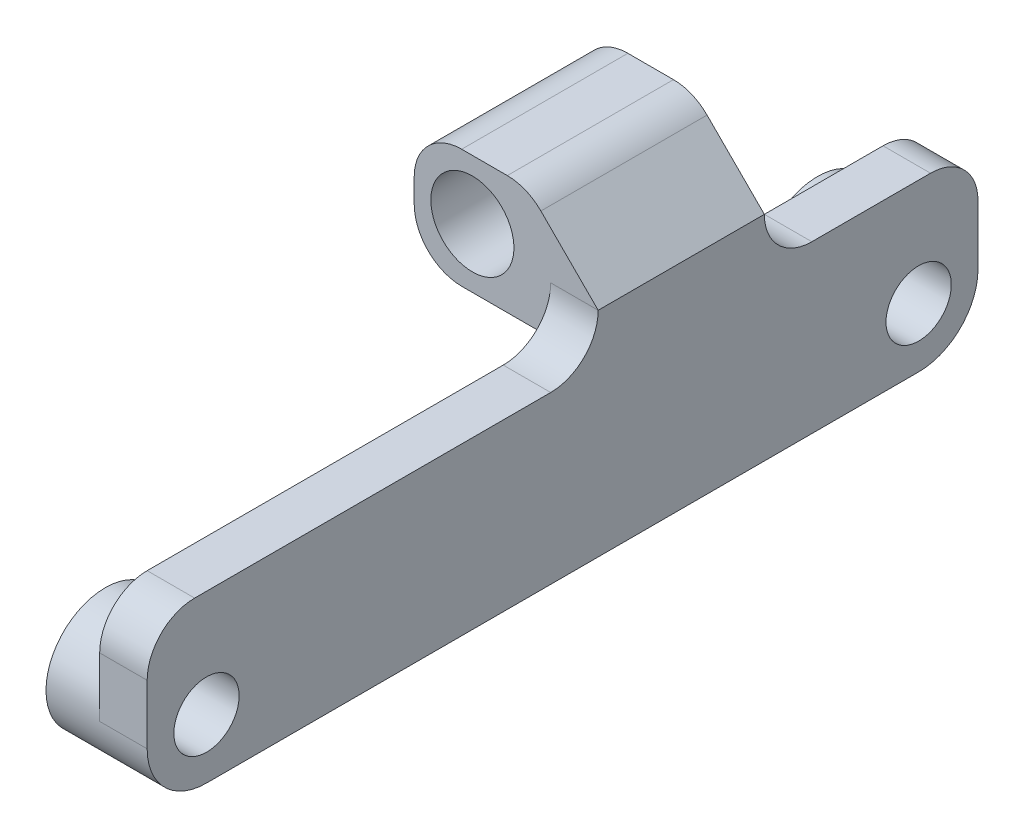
ISO-10303-21;
HEADER;
FILE_DESCRIPTION(('STEP AP214'),'2;1');
FILE_NAME('part.step','',(''),(''),'','','');
FILE_SCHEMA(('AUTOMOTIVE_DESIGN { 1 0 10303 214 1 1 1 1 }'));
ENDSEC;
DATA;
#1=APPLICATION_CONTEXT('core data for automotive mechanical design processes');
#2=APPLICATION_PROTOCOL_DEFINITION('international standard','automotive_design',2000,#1);
#3=PRODUCT_CONTEXT('',#1,'mechanical');
#4=PRODUCT('Part','Part','',(#3));
#5=PRODUCT_RELATED_PRODUCT_CATEGORY('part','',(#4));
#6=PRODUCT_DEFINITION_FORMATION('','',#4);
#7=PRODUCT_DEFINITION_CONTEXT('part definition',#1,'design');
#8=PRODUCT_DEFINITION('design','',#6,#7);
#9=PRODUCT_DEFINITION_SHAPE('','',#8);
#10=(LENGTH_UNIT() NAMED_UNIT(*) SI_UNIT(.MILLI.,.METRE.));
#11=(NAMED_UNIT(*) PLANE_ANGLE_UNIT() SI_UNIT($,.RADIAN.));
#12=(NAMED_UNIT(*) SI_UNIT($,.STERADIAN.) SOLID_ANGLE_UNIT());
#13=UNCERTAINTY_MEASURE_WITH_UNIT(LENGTH_MEASURE(1.E-05),#10,'distance_accuracy_value','');
#14=(GEOMETRIC_REPRESENTATION_CONTEXT(3) GLOBAL_UNCERTAINTY_ASSIGNED_CONTEXT((#13)) GLOBAL_UNIT_ASSIGNED_CONTEXT((#10,
#11,#12)) REPRESENTATION_CONTEXT('',''));
#15=CARTESIAN_POINT('',(0.,0.,0.));
#16=DIRECTION('',(0.,0.,1.));
#17=DIRECTION('',(1.,0.,0.));
#18=AXIS2_PLACEMENT_3D('',#15,#16,#17);
#19=CARTESIAN_POINT('',(9.1,8.99999999999958,-35.));
#20=DIRECTION('',(0.,-1.,0.));
#21=DIRECTION('',(0.,0.,-1.));
#22=AXIS2_PLACEMENT_3D('',#19,#20,#21);
#23=PLANE('',#22);
#24=DIRECTION('',(0.,0.,1.));
#25=VECTOR('',#24,1.);
#26=CARTESIAN_POINT('',(5.1,8.99999999999958,-35.));
#27=LINE('',#26,#25);
#28=CARTESIAN_POINT('',(5.1,8.99999999999958,1.));
#29=VERTEX_POINT('',#28);
#30=CARTESIAN_POINT('',(5.1,8.99999999999958,31.));
#31=VERTEX_POINT('',#30);
#32=EDGE_CURVE('E323',#29,#31,#27,.T.);
#33=ORIENTED_EDGE('',*,*,#32,.T.);
#34=DIRECTION('',(-1.,0.,0.));
#35=VECTOR('',#34,1.);
#36=CARTESIAN_POINT('',(9.1,8.99999999999958,31.));
#37=LINE('',#36,#35);
#38=CARTESIAN_POINT('',(9.1,8.99999999999958,31.));
#39=VERTEX_POINT('',#38);
#40=EDGE_CURVE('E59',#31,#39,#37,.F.);
#41=ORIENTED_EDGE('',*,*,#40,.T.);
#42=DIRECTION('',(0.,0.,1.));
#43=VECTOR('',#42,1.);
#44=CARTESIAN_POINT('',(9.1,8.99999999999958,-35.));
#45=LINE('',#44,#43);
#46=CARTESIAN_POINT('',(9.1,8.99999999999958,1.));
#47=VERTEX_POINT('',#46);
#48=EDGE_CURVE('E328',#47,#39,#45,.T.);
#49=ORIENTED_EDGE('',*,*,#48,.F.);
#50=DIRECTION('',(1.,0.,0.));
#51=VECTOR('',#50,1.);
#52=CARTESIAN_POINT('',(5.1,8.99999999999958,1.));
#53=LINE('',#52,#51);
#54=EDGE_CURVE('E209',#47,#29,#53,.F.);
#55=ORIENTED_EDGE('',*,*,#54,.T.);
#56=EDGE_LOOP('',(#33,#41,#49,#55));
#57=FACE_BOUND('',#56,.T.);
#58=ADVANCED_FACE('F35',(#57),#23,.F.);
#59=CARTESIAN_POINT('',(9.1,8.99999999999958,-31.));
#60=VERTEX_POINT('',#59);
#61=CARTESIAN_POINT('',(9.1,8.99999999999958,-21.));
#62=VERTEX_POINT('',#61);
#63=EDGE_CURVE('E175',#60,#62,#45,.T.);
#64=ORIENTED_EDGE('',*,*,#63,.F.);
#65=DIRECTION('',(-1.,0.,0.));
#66=VECTOR('',#65,1.);
#67=CARTESIAN_POINT('',(9.1,8.99999999999958,-31.));
#68=LINE('',#67,#66);
#69=CARTESIAN_POINT('',(5.1,8.99999999999958,-31.));
#70=VERTEX_POINT('',#69);
#71=EDGE_CURVE('E180',#60,#70,#68,.T.);
#72=ORIENTED_EDGE('',*,*,#71,.T.);
#73=CARTESIAN_POINT('',(5.1,8.99999999999958,-21.));
#74=VERTEX_POINT('',#73);
#75=EDGE_CURVE('E316',#70,#74,#27,.T.);
#76=ORIENTED_EDGE('',*,*,#75,.T.);
#77=DIRECTION('',(-1.,0.,0.));
#78=VECTOR('',#77,1.);
#79=CARTESIAN_POINT('',(9.1,8.99999999999958,-21.));
#80=LINE('',#79,#78);
#81=EDGE_CURVE('E204',#74,#62,#80,.F.);
#82=ORIENTED_EDGE('',*,*,#81,.T.);
#83=EDGE_LOOP('',(#64,#72,#76,#82));
#84=FACE_BOUND('',#83,.T.);
#85=ADVANCED_FACE('F253',(#84),#23,.F.);
#86=CARTESIAN_POINT('',(5.1,0.,-30.));
#87=DIRECTION('',(-1.,0.,0.));
#88=DIRECTION('',(0.,0.,1.));
#89=AXIS2_PLACEMENT_3D('',#86,#87,#88);
#90=CYLINDRICAL_SURFACE('',#89,5.);
#91=CARTESIAN_POINT('',(0.577350269189624,0.,-30.));
#92=DIRECTION('',(1.,0.,0.));
#93=DIRECTION('',(0.,0.,-1.));
#94=AXIS2_PLACEMENT_3D('',#91,#92,#93);
#95=CIRCLE('',#94,5.);
#96=CARTESIAN_POINT('',(0.577350269189624,0.,-35.));
#97=VERTEX_POINT('',#96);
#98=EDGE_CURVE('E44',#97,#97,#95,.T.);
#99=ORIENTED_EDGE('',*,*,#98,.T.);
#100=EDGE_LOOP('',(#99));
#101=FACE_BOUND('',#100,.T.);
#102=CARTESIAN_POINT('',(5.1,0.,-30.));
#103=DIRECTION('',(1.,0.,0.));
#104=DIRECTION('',(0.,0.,-1.));
#105=AXIS2_PLACEMENT_3D('',#102,#103,#104);
#106=CIRCLE('',#105,5.);
#107=CARTESIAN_POINT('',(5.1,0.,-35.));
#108=VERTEX_POINT('',#107);
#109=CARTESIAN_POINT('',(5.1,-5.,-30.));
#110=VERTEX_POINT('',#109);
#111=EDGE_CURVE('E341',#108,#110,#106,.T.);
#112=ORIENTED_EDGE('',*,*,#111,.F.);
#113=DIRECTION('',(-1.,0.,0.));
#114=VECTOR('',#113,1.);
#115=CARTESIAN_POINT('',(9.1,0.,-35.));
#116=LINE('',#115,#114);
#117=CARTESIAN_POINT('',(9.1,0.,-35.));
#118=VERTEX_POINT('',#117);
#119=EDGE_CURVE('E329',#118,#108,#116,.T.);
#120=ORIENTED_EDGE('',*,*,#119,.F.);
#121=CARTESIAN_POINT('',(9.1,0.,-30.));
#122=DIRECTION('',(1.,0.,0.));
#123=DIRECTION('',(0.,0.,-1.));
#124=AXIS2_PLACEMENT_3D('',#121,#122,#123);
#125=CIRCLE('',#124,5.);
#126=CARTESIAN_POINT('',(9.1,-5.,-30.));
#127=VERTEX_POINT('',#126);
#128=EDGE_CURVE('E408',#127,#118,#125,.T.);
#129=ORIENTED_EDGE('',*,*,#128,.F.);
#130=DIRECTION('',(-1.,0.,0.));
#131=VECTOR('',#130,1.);
#132=CARTESIAN_POINT('',(9.1,-5.,-30.));
#133=LINE('',#132,#131);
#134=EDGE_CURVE('E332',#127,#110,#133,.T.);
#135=ORIENTED_EDGE('',*,*,#134,.T.);
#136=EDGE_LOOP('',(#112,#120,#129,#135));
#137=FACE_BOUND('',#136,.T.);
#138=ADVANCED_FACE('F240',(#101,#137),#90,.T.);
#139=CARTESIAN_POINT('',(0.,0.,-30.));
#140=DIRECTION('',(1.,0.,0.));
#141=DIRECTION('',(0.,0.,-1.));
#142=AXIS2_PLACEMENT_3D('',#139,#140,#141);
#143=PLANE('',#142);
#144=CARTESIAN_POINT('',(0.,0.,-30.));
#145=DIRECTION('',(1.,0.,0.));
#146=DIRECTION('',(0.,0.,-1.));
#147=AXIS2_PLACEMENT_3D('',#144,#145,#146);
#148=CIRCLE('',#147,4.);
#149=CARTESIAN_POINT('',(0.,0.,-34.));
#150=VERTEX_POINT('',#149);
#151=EDGE_CURVE('E11',#150,#150,#148,.F.);
#152=ORIENTED_EDGE('',*,*,#151,.T.);
#153=EDGE_LOOP('',(#152));
#154=FACE_BOUND('',#153,.T.);
#155=CARTESIAN_POINT('',(0.,0.,-30.));
#156=DIRECTION('',(-1.,0.,0.));
#157=DIRECTION('',(0.,0.,1.));
#158=AXIS2_PLACEMENT_3D('',#155,#156,#157);
#159=CIRCLE('',#158,2.75);
#160=CARTESIAN_POINT('',(0.,0.,-27.25));
#161=VERTEX_POINT('',#160);
#162=EDGE_CURVE('E680',#161,#161,#159,.T.);
#163=ORIENTED_EDGE('',*,*,#162,.F.);
#164=EDGE_LOOP('',(#163));
#165=FACE_BOUND('',#164,.T.);
#166=ADVANCED_FACE('F264',(#154,#165),#143,.F.);
#167=CARTESIAN_POINT('',(5.1,-4.18977760661176E-13,30.));
#168=DIRECTION('',(1.,0.,0.));
#169=DIRECTION('',(0.,0.,-1.));
#170=AXIS2_PLACEMENT_3D('',#167,#168,#169);
#171=PLANE('',#170);
#172=ORIENTED_EDGE('',*,*,#75,.F.);
#173=CARTESIAN_POINT('',(5.1,4.99999999999958,-31.));
#174=DIRECTION('',(1.,0.,0.));
#175=DIRECTION('',(0.,0.,-1.));
#176=AXIS2_PLACEMENT_3D('',#173,#174,#175);
#177=CIRCLE('',#176,4.);
#178=CARTESIAN_POINT('',(5.1,4.99999999999958,-35.));
#179=VERTEX_POINT('',#178);
#180=EDGE_CURVE('E221',#70,#179,#177,.F.);
#181=ORIENTED_EDGE('',*,*,#180,.T.);
#182=DIRECTION('',(0.,1.,0.));
#183=VECTOR('',#182,1.);
#184=CARTESIAN_POINT('',(5.1,8.99999999999958,-35.));
#185=LINE('',#184,#183);
#186=EDGE_CURVE('E319',#108,#179,#185,.T.);
#187=ORIENTED_EDGE('',*,*,#186,.F.);
#188=ORIENTED_EDGE('',*,*,#111,.T.);
#189=DIRECTION('',(0.,0.,-1.));
#190=VECTOR('',#189,1.);
#191=CARTESIAN_POINT('',(5.1,-5.,-30.));
#192=LINE('',#191,#190);
#193=CARTESIAN_POINT('',(5.1,-5.00000000000021,30.));
#194=VERTEX_POINT('',#193);
#195=EDGE_CURVE('E315',#194,#110,#192,.T.);
#196=ORIENTED_EDGE('',*,*,#195,.F.);
#197=CARTESIAN_POINT('',(5.1,-4.18977760661176E-13,30.));
#198=DIRECTION('',(1.,0.,0.));
#199=DIRECTION('',(0.,0.,-1.));
#200=AXIS2_PLACEMENT_3D('',#197,#198,#199);
#201=CIRCLE('',#200,5.);
#202=CARTESIAN_POINT('',(5.1,-4.18977760661176E-13,35.));
#203=VERTEX_POINT('',#202);
#204=EDGE_CURVE('E313',#194,#203,#201,.T.);
#205=ORIENTED_EDGE('',*,*,#204,.T.);
#206=DIRECTION('',(0.,-1.,0.));
#207=VECTOR('',#206,1.);
#208=CARTESIAN_POINT('',(5.1,-4.18977760661176E-13,35.));
#209=LINE('',#208,#207);
#210=CARTESIAN_POINT('',(5.1,4.99999999999958,35.));
#211=VERTEX_POINT('',#210);
#212=EDGE_CURVE('E306',#211,#203,#209,.T.);
#213=ORIENTED_EDGE('',*,*,#212,.F.);
#214=CARTESIAN_POINT('',(5.1,4.99999999999958,31.));
#215=DIRECTION('',(1.,0.,0.));
#216=DIRECTION('',(0.,0.,-1.));
#217=AXIS2_PLACEMENT_3D('',#214,#215,#216);
#218=CIRCLE('',#217,4.);
#219=EDGE_CURVE('E219',#211,#31,#218,.F.);
#220=ORIENTED_EDGE('',*,*,#219,.T.);
#221=ORIENTED_EDGE('',*,*,#32,.F.);
#222=CARTESIAN_POINT('',(5.1,12.9999999999996,1.));
#223=DIRECTION('',(1.,0.,0.));
#224=DIRECTION('',(0.,0.,-1.));
#225=AXIS2_PLACEMENT_3D('',#222,#223,#224);
#226=CIRCLE('',#225,4.);
#227=CARTESIAN_POINT('',(5.1,12.9999999999996,-3.));
#228=VERTEX_POINT('',#227);
#229=EDGE_CURVE('E214',#29,#228,#226,.T.);
#230=ORIENTED_EDGE('',*,*,#229,.T.);
#231=DIRECTION('',(0.,1.,0.));
#232=VECTOR('',#231,1.);
#233=CARTESIAN_POINT('',(5.1,-4.18977760661176E-13,-3.));
#234=LINE('',#233,#232);
#235=CARTESIAN_POINT('',(5.1,8.99999999999958,-3.));
#236=VERTEX_POINT('',#235);
#237=EDGE_CURVE('E369',#236,#228,#234,.T.);
#238=ORIENTED_EDGE('',*,*,#237,.F.);
#239=CARTESIAN_POINT('',(5.1,8.99999999999958,-17.));
#240=VERTEX_POINT('',#239);
#241=EDGE_CURVE('E321',#240,#236,#27,.T.);
#242=ORIENTED_EDGE('',*,*,#241,.F.);
#243=DIRECTION('',(0.,-1.,0.));
#244=VECTOR('',#243,1.);
#245=CARTESIAN_POINT('',(5.1,-4.18977760661176E-13,-17.));
#246=LINE('',#245,#244);
#247=CARTESIAN_POINT('',(5.1,12.9999999999996,-17.));
#248=VERTEX_POINT('',#247);
#249=EDGE_CURVE('E205',#248,#240,#246,.T.);
#250=ORIENTED_EDGE('',*,*,#249,.F.);
#251=CARTESIAN_POINT('',(5.1,12.9999999999996,-21.));
#252=DIRECTION('',(1.,0.,0.));
#253=DIRECTION('',(0.,0.,-1.));
#254=AXIS2_PLACEMENT_3D('',#251,#252,#253);
#255=CIRCLE('',#254,4.);
#256=EDGE_CURVE('E181',#248,#74,#255,.T.);
#257=ORIENTED_EDGE('',*,*,#256,.T.);
#258=EDGE_LOOP('',(#172,#181,#187,#188,#196,#205,#213,#220,#221,#230,#238,#242,#250,#257));
#259=FACE_BOUND('',#258,.T.);
#260=ADVANCED_FACE('F267',(#259),#171,.F.);
#261=CARTESIAN_POINT('',(9.1,-4.18977760661176E-13,35.));
#262=DIRECTION('',(0.,0.,-1.));
#263=DIRECTION('',(-1.,0.,0.));
#264=AXIS2_PLACEMENT_3D('',#261,#262,#263);
#265=PLANE('',#264);
#266=DIRECTION('',(0.,-1.,0.));
#267=VECTOR('',#266,1.);
#268=CARTESIAN_POINT('',(9.1,4.99999999999959,35.));
#269=LINE('',#268,#267);
#270=CARTESIAN_POINT('',(9.1,4.99999999999958,35.));
#271=VERTEX_POINT('',#270);
#272=CARTESIAN_POINT('',(9.1,-4.18977760661176E-13,35.));
#273=VERTEX_POINT('',#272);
#274=EDGE_CURVE('E308',#271,#273,#269,.T.);
#275=ORIENTED_EDGE('',*,*,#274,.F.);
#276=DIRECTION('',(-1.,0.,0.));
#277=VECTOR('',#276,1.);
#278=CARTESIAN_POINT('',(9.1,4.99999999999958,35.));
#279=LINE('',#278,#277);
#280=EDGE_CURVE('E228',#271,#211,#279,.T.);
#281=ORIENTED_EDGE('',*,*,#280,.T.);
#282=ORIENTED_EDGE('',*,*,#212,.T.);
#283=DIRECTION('',(-1.,0.,0.));
#284=VECTOR('',#283,1.);
#285=CARTESIAN_POINT('',(9.1,-4.18977760661176E-13,35.));
#286=LINE('',#285,#284);
#287=EDGE_CURVE('E339',#273,#203,#286,.T.);
#288=ORIENTED_EDGE('',*,*,#287,.F.);
#289=EDGE_LOOP('',(#275,#281,#282,#288));
#290=FACE_BOUND('',#289,.T.);
#291=ADVANCED_FACE('F262',(#290),#265,.F.);
#292=CARTESIAN_POINT('',(9.1,-4.18977760661176E-13,30.));
#293=DIRECTION('',(-1.,0.,0.));
#294=DIRECTION('',(0.,0.,1.));
#295=AXIS2_PLACEMENT_3D('',#292,#293,#294);
#296=CYLINDRICAL_SURFACE('',#295,4.99999999999979);
#297=CARTESIAN_POINT('',(0.57735026918951,-4.18977760661176E-13,30.));
#298=DIRECTION('',(1.,0.,0.));
#299=DIRECTION('',(0.,0.,-1.));
#300=AXIS2_PLACEMENT_3D('',#297,#298,#299);
#301=CIRCLE('',#300,4.99999999999979);
#302=CARTESIAN_POINT('',(0.57735026918951,-4.18977760661176E-13,25.0000000000002));
#303=VERTEX_POINT('',#302);
#304=EDGE_CURVE('E232',#303,#303,#301,.T.);
#305=ORIENTED_EDGE('',*,*,#304,.T.);
#306=EDGE_LOOP('',(#305));
#307=FACE_BOUND('',#306,.T.);
#308=ORIENTED_EDGE('',*,*,#287,.T.);
#309=ORIENTED_EDGE('',*,*,#204,.F.);
#310=DIRECTION('',(-1.,0.,0.));
#311=VECTOR('',#310,1.);
#312=CARTESIAN_POINT('',(9.1,-5.00000000000021,30.));
#313=LINE('',#312,#311);
#314=CARTESIAN_POINT('',(9.1,-5.00000000000021,30.));
#315=VERTEX_POINT('',#314);
#316=EDGE_CURVE('E336',#315,#194,#313,.T.);
#317=ORIENTED_EDGE('',*,*,#316,.F.);
#318=CARTESIAN_POINT('',(9.1,-4.18977760661176E-13,30.));
#319=DIRECTION('',(1.,0.,0.));
#320=DIRECTION('',(0.,0.,-1.));
#321=AXIS2_PLACEMENT_3D('',#318,#319,#320);
#322=CIRCLE('',#321,4.99999999999979);
#323=EDGE_CURVE('E404',#273,#315,#322,.T.);
#324=ORIENTED_EDGE('',*,*,#323,.F.);
#325=EDGE_LOOP('',(#308,#309,#317,#324));
#326=FACE_BOUND('',#325,.T.);
#327=ADVANCED_FACE('F425',(#307,#326),#296,.T.);
#328=CARTESIAN_POINT('',(9.1,-5.,-30.));
#329=DIRECTION('',(0.,1.,0.));
#330=DIRECTION('',(0.,0.,1.));
#331=AXIS2_PLACEMENT_3D('',#328,#329,#330);
#332=PLANE('',#331);
#333=ORIENTED_EDGE('',*,*,#195,.T.);
#334=ORIENTED_EDGE('',*,*,#134,.F.);
#335=DIRECTION('',(0.,0.,-1.));
#336=VECTOR('',#335,1.);
#337=CARTESIAN_POINT('',(9.1,-5.,-30.));
#338=LINE('',#337,#336);
#339=EDGE_CURVE('E406',#315,#127,#338,.T.);
#340=ORIENTED_EDGE('',*,*,#339,.F.);
#341=ORIENTED_EDGE('',*,*,#316,.T.);
#342=EDGE_LOOP('',(#333,#334,#340,#341));
#343=FACE_BOUND('',#342,.T.);
#344=ADVANCED_FACE('F420',(#343),#332,.F.);
#345=CARTESIAN_POINT('',(9.1,8.99999999999958,-35.));
#346=DIRECTION('',(0.,0.,1.));
#347=DIRECTION('',(1.,0.,0.));
#348=AXIS2_PLACEMENT_3D('',#345,#346,#347);
#349=PLANE('',#348);
#350=ORIENTED_EDGE('',*,*,#186,.T.);
#351=DIRECTION('',(-1.,0.,0.));
#352=VECTOR('',#351,1.);
#353=CARTESIAN_POINT('',(9.1,4.99999999999958,-35.));
#354=LINE('',#353,#352);
#355=CARTESIAN_POINT('',(9.1,4.99999999999958,-35.));
#356=VERTEX_POINT('',#355);
#357=EDGE_CURVE('E223',#179,#356,#354,.F.);
#358=ORIENTED_EDGE('',*,*,#357,.T.);
#359=DIRECTION('',(0.,1.,0.));
#360=VECTOR('',#359,1.);
#361=CARTESIAN_POINT('',(9.1,8.99999999999958,-35.));
#362=LINE('',#361,#360);
#363=EDGE_CURVE('E333',#118,#356,#362,.T.);
#364=ORIENTED_EDGE('',*,*,#363,.F.);
#365=ORIENTED_EDGE('',*,*,#119,.T.);
#366=EDGE_LOOP('',(#350,#358,#364,#365));
#367=FACE_BOUND('',#366,.T.);
#368=ADVANCED_FACE('F417',(#367),#349,.F.);
#369=CARTESIAN_POINT('',(9.1,-4.18977760661176E-13,30.));
#370=DIRECTION('',(1.,0.,0.));
#371=DIRECTION('',(0.,0.,-1.));
#372=AXIS2_PLACEMENT_3D('',#369,#370,#371);
#373=PLANE('',#372);
#374=CARTESIAN_POINT('',(9.1,0.,-30.));
#375=DIRECTION('',(-1.,0.,0.));
#376=DIRECTION('',(0.,0.,1.));
#377=AXIS2_PLACEMENT_3D('',#374,#375,#376);
#378=CIRCLE('',#377,2.75);
#379=CARTESIAN_POINT('',(9.1,0.,-27.25));
#380=VERTEX_POINT('',#379);
#381=EDGE_CURVE('E677',#380,#380,#378,.T.);
#382=ORIENTED_EDGE('',*,*,#381,.T.);
#383=EDGE_LOOP('',(#382));
#384=FACE_BOUND('',#383,.T.);
#385=CARTESIAN_POINT('',(9.1,-4.18977760661176E-13,30.));
#386=DIRECTION('',(-1.,0.,0.));
#387=DIRECTION('',(0.,0.,1.));
#388=AXIS2_PLACEMENT_3D('',#385,#386,#387);
#389=CIRCLE('',#388,2.75);
#390=CARTESIAN_POINT('',(9.1,-4.18977760661176E-13,32.75));
#391=VERTEX_POINT('',#390);
#392=EDGE_CURVE('E682',#391,#391,#389,.T.);
#393=ORIENTED_EDGE('',*,*,#392,.T.);
#394=EDGE_LOOP('',(#393));
#395=FACE_BOUND('',#394,.T.);
#396=ORIENTED_EDGE('',*,*,#363,.T.);
#397=CARTESIAN_POINT('',(9.1,4.99999999999958,-31.));
#398=DIRECTION('',(1.,0.,0.));
#399=DIRECTION('',(0.,0.,-1.));
#400=AXIS2_PLACEMENT_3D('',#397,#398,#399);
#401=CIRCLE('',#400,4.);
#402=EDGE_CURVE('E226',#356,#60,#401,.T.);
#403=ORIENTED_EDGE('',*,*,#402,.T.);
#404=ORIENTED_EDGE('',*,*,#63,.T.);
#405=CARTESIAN_POINT('',(9.1,12.9999999999996,-21.));
#406=DIRECTION('',(1.,0.,0.));
#407=DIRECTION('',(0.,0.,-1.));
#408=AXIS2_PLACEMENT_3D('',#405,#406,#407);
#409=CIRCLE('',#408,4.);
#410=CARTESIAN_POINT('',(9.1,12.9999999999996,-17.));
#411=VERTEX_POINT('',#410);
#412=EDGE_CURVE('E168',#62,#411,#409,.F.);
#413=ORIENTED_EDGE('',*,*,#412,.T.);
#414=DIRECTION('',(0.,0.,-1.));
#415=VECTOR('',#414,1.);
#416=CARTESIAN_POINT('',(9.1,12.9999999999996,-3.));
#417=LINE('',#416,#415);
#418=CARTESIAN_POINT('',(9.1,12.9999999999996,-3.));
#419=VERTEX_POINT('',#418);
#420=EDGE_CURVE('E173',#419,#411,#417,.T.);
#421=ORIENTED_EDGE('',*,*,#420,.F.);
#422=CARTESIAN_POINT('',(9.1,12.9999999999996,1.));
#423=DIRECTION('',(1.,0.,0.));
#424=DIRECTION('',(0.,0.,-1.));
#425=AXIS2_PLACEMENT_3D('',#422,#423,#424);
#426=CIRCLE('',#425,4.);
#427=EDGE_CURVE('E207',#419,#47,#426,.F.);
#428=ORIENTED_EDGE('',*,*,#427,.T.);
#429=ORIENTED_EDGE('',*,*,#48,.T.);
#430=CARTESIAN_POINT('',(9.1,4.99999999999958,31.));
#431=DIRECTION('',(1.,0.,0.));
#432=DIRECTION('',(0.,0.,-1.));
#433=AXIS2_PLACEMENT_3D('',#430,#431,#432);
#434=CIRCLE('',#433,4.);
#435=EDGE_CURVE('E51',#39,#271,#434,.T.);
#436=ORIENTED_EDGE('',*,*,#435,.T.);
#437=ORIENTED_EDGE('',*,*,#274,.T.);
#438=ORIENTED_EDGE('',*,*,#323,.T.);
#439=ORIENTED_EDGE('',*,*,#339,.T.);
#440=ORIENTED_EDGE('',*,*,#128,.T.);
#441=EDGE_LOOP('',(#396,#403,#404,#413,#421,#428,#429,#436,#437,#438,#439,#440));
#442=FACE_BOUND('',#441,.T.);
#443=ADVANCED_FACE('F171',(#384,#395,#442),#373,.T.);
#444=CARTESIAN_POINT('',(0.,-4.18977760661176E-13,30.));
#445=DIRECTION('',(1.,0.,0.));
#446=DIRECTION('',(0.,0.,-1.));
#447=AXIS2_PLACEMENT_3D('',#444,#445,#446);
#448=PLANE('',#447);
#449=CARTESIAN_POINT('',(0.,-4.18977760661176E-13,30.));
#450=DIRECTION('',(1.,0.,0.));
#451=DIRECTION('',(0.,0.,-1.));
#452=AXIS2_PLACEMENT_3D('',#449,#450,#451);
#453=CIRCLE('',#452,3.99999999999999);
#454=CARTESIAN_POINT('',(0.,-4.18977760661176E-13,26.));
#455=VERTEX_POINT('',#454);
#456=EDGE_CURVE('E235',#455,#455,#453,.F.);
#457=ORIENTED_EDGE('',*,*,#456,.T.);
#458=EDGE_LOOP('',(#457));
#459=FACE_BOUND('',#458,.T.);
#460=CARTESIAN_POINT('',(0.,-4.18977760661176E-13,30.));
#461=DIRECTION('',(-1.,0.,0.));
#462=DIRECTION('',(0.,0.,1.));
#463=AXIS2_PLACEMENT_3D('',#460,#461,#462);
#464=CIRCLE('',#463,2.75);
#465=CARTESIAN_POINT('',(0.,-4.18977760661176E-13,32.75));
#466=VERTEX_POINT('',#465);
#467=EDGE_CURVE('E687',#466,#466,#464,.T.);
#468=ORIENTED_EDGE('',*,*,#467,.F.);
#469=EDGE_LOOP('',(#468));
#470=FACE_BOUND('',#469,.T.);
#471=ADVANCED_FACE('F441',(#459,#470),#448,.F.);
#472=CARTESIAN_POINT('',(0.,8.99999999999958,0.));
#473=DIRECTION('',(0.,1.,0.));
#474=DIRECTION('',(0.,0.,1.));
#475=AXIS2_PLACEMENT_3D('',#472,#473,#474);
#476=PLANE('',#475);
#477=DIRECTION('',(1.,0.,0.));
#478=VECTOR('',#477,1.);
#479=CARTESIAN_POINT('',(-4.9,8.99999999999958,-3.));
#480=LINE('',#479,#478);
#481=CARTESIAN_POINT('',(-2.4,8.99999999999958,-3.));
#482=VERTEX_POINT('',#481);
#483=EDGE_CURVE('E383',#482,#236,#480,.T.);
#484=ORIENTED_EDGE('',*,*,#483,.F.);
#485=DIRECTION('',(0.,0.,1.));
#486=VECTOR('',#485,1.);
#487=CARTESIAN_POINT('',(-2.4,8.99999999999958,0.));
#488=LINE('',#487,#486);
#489=CARTESIAN_POINT('',(-2.4,8.99999999999958,-17.));
#490=VERTEX_POINT('',#489);
#491=EDGE_CURVE('E367',#482,#490,#488,.F.);
#492=ORIENTED_EDGE('',*,*,#491,.T.);
#493=DIRECTION('',(-1.,0.,0.));
#494=VECTOR('',#493,1.);
#495=CARTESIAN_POINT('',(-4.9,8.99999999999958,-17.));
#496=LINE('',#495,#494);
#497=EDGE_CURVE('E199',#240,#490,#496,.T.);
#498=ORIENTED_EDGE('',*,*,#497,.F.);
#499=ORIENTED_EDGE('',*,*,#241,.T.);
#500=EDGE_LOOP('',(#484,#492,#498,#499));
#501=FACE_BOUND('',#500,.T.);
#502=ADVANCED_FACE('F389',(#501),#476,.F.);
#503=CARTESIAN_POINT('',(-4.9,12.9999999999996,-3.));
#504=DIRECTION('',(0.,0.,-1.));
#505=DIRECTION('',(-1.,0.,0.));
#506=AXIS2_PLACEMENT_3D('',#503,#504,#505);
#507=PLANE('',#506);
#508=ORIENTED_EDGE('',*,*,#237,.T.);
#509=DIRECTION('',(1.,0.,0.));
#510=VECTOR('',#509,1.);
#511=CARTESIAN_POINT('',(9.1,12.9999999999996,-3.));
#512=LINE('',#511,#510);
#513=EDGE_CURVE('E372',#228,#419,#512,.T.);
#514=ORIENTED_EDGE('',*,*,#513,.T.);
#515=DIRECTION('',(-0.707106781186547,0.707106781186548,0.));
#516=VECTOR('',#515,1.);
#517=CARTESIAN_POINT('',(9.1,12.9999999999996,-3.));
#518=LINE('',#517,#516);
#519=CARTESIAN_POINT('',(4.27157287525381,17.8284271247458,-3.));
#520=VERTEX_POINT('',#519);
#521=EDGE_CURVE('E193',#419,#520,#518,.T.);
#522=ORIENTED_EDGE('',*,*,#521,.T.);
#523=CARTESIAN_POINT('',(1.44314575050762,14.9999999999996,-3.));
#524=DIRECTION('',(0.,0.,-1.));
#525=DIRECTION('',(-1.,0.,0.));
#526=AXIS2_PLACEMENT_3D('',#523,#524,#525);
#527=CIRCLE('',#526,4.);
#528=CARTESIAN_POINT('',(1.44314575050762,18.9999999999996,-3.));
#529=VERTEX_POINT('',#528);
#530=EDGE_CURVE('E360',#520,#529,#527,.F.);
#531=ORIENTED_EDGE('',*,*,#530,.T.);
#532=DIRECTION('',(1.,0.,0.));
#533=VECTOR('',#532,1.);
#534=CARTESIAN_POINT('',(3.1,18.9999999999996,-3.));
#535=LINE('',#534,#533);
#536=CARTESIAN_POINT('',(-2.4,18.9999999999996,-3.));
#537=VERTEX_POINT('',#536);
#538=EDGE_CURVE('E697',#537,#529,#535,.T.);
#539=ORIENTED_EDGE('',*,*,#538,.F.);
#540=CARTESIAN_POINT('',(-2.4,14.9999999999996,-3.));
#541=DIRECTION('',(0.,0.,-1.));
#542=DIRECTION('',(-1.,0.,0.));
#543=AXIS2_PLACEMENT_3D('',#540,#541,#542);
#544=CIRCLE('',#543,4.);
#545=CARTESIAN_POINT('',(-6.4,14.9999999999996,-3.));
#546=VERTEX_POINT('',#545);
#547=EDGE_CURVE('E356',#537,#546,#544,.F.);
#548=ORIENTED_EDGE('',*,*,#547,.T.);
#549=DIRECTION('',(0.,-1.,0.));
#550=VECTOR('',#549,1.);
#551=CARTESIAN_POINT('',(-6.4,12.9999999999996,-3.));
#552=LINE('',#551,#550);
#553=CARTESIAN_POINT('',(-6.4,12.9999999999996,-3.));
#554=VERTEX_POINT('',#553);
#555=EDGE_CURVE('E198',#546,#554,#552,.T.);
#556=ORIENTED_EDGE('',*,*,#555,.T.);
#557=CARTESIAN_POINT('',(-2.4,12.9999999999996,-3.));
#558=DIRECTION('',(0.,0.,-1.));
#559=DIRECTION('',(-1.,0.,0.));
#560=AXIS2_PLACEMENT_3D('',#557,#558,#559);
#561=CIRCLE('',#560,4.);
#562=EDGE_CURVE('E358',#554,#482,#561,.F.);
#563=ORIENTED_EDGE('',*,*,#562,.T.);
#564=ORIENTED_EDGE('',*,*,#483,.T.);
#565=EDGE_LOOP('',(#508,#514,#522,#531,#539,#548,#556,#563,#564));
#566=FACE_BOUND('',#565,.T.);
#567=CARTESIAN_POINT('',(-1.5,14.,-3.));
#568=DIRECTION('',(0.,0.,-1.));
#569=DIRECTION('',(-1.,0.,0.));
#570=AXIS2_PLACEMENT_3D('',#567,#568,#569);
#571=CIRCLE('',#570,3.5);
#572=CARTESIAN_POINT('',(-4.99999999999999,14.,-3.));
#573=VERTEX_POINT('',#572);
#574=EDGE_CURVE('E694',#573,#573,#571,.F.);
#575=ORIENTED_EDGE('',*,*,#574,.F.);
#576=EDGE_LOOP('',(#575));
#577=FACE_BOUND('',#576,.T.);
#578=ADVANCED_FACE('F378',(#566,#577),#507,.F.);
#579=CARTESIAN_POINT('',(-4.9,12.9999999999996,-17.));
#580=DIRECTION('',(0.,0.,1.));
#581=DIRECTION('',(1.,0.,0.));
#582=AXIS2_PLACEMENT_3D('',#579,#580,#581);
#583=PLANE('',#582);
#584=CARTESIAN_POINT('',(-1.5,14.,-17.));
#585=DIRECTION('',(0.,0.,1.));
#586=DIRECTION('',(1.,0.,0.));
#587=AXIS2_PLACEMENT_3D('',#584,#585,#586);
#588=CIRCLE('',#587,3.5);
#589=CARTESIAN_POINT('',(2.,14.,-17.));
#590=VERTEX_POINT('',#589);
#591=EDGE_CURVE('E684',#590,#590,#588,.T.);
#592=ORIENTED_EDGE('',*,*,#591,.T.);
#593=EDGE_LOOP('',(#592));
#594=FACE_BOUND('',#593,.T.);
#595=DIRECTION('',(0.707106781186547,-0.707106781186548,0.));
#596=VECTOR('',#595,1.);
#597=CARTESIAN_POINT('',(9.1,12.9999999999996,-17.));
#598=LINE('',#597,#596);
#599=CARTESIAN_POINT('',(4.27157287525381,17.8284271247458,-17.));
#600=VERTEX_POINT('',#599);
#601=EDGE_CURVE('E186',#600,#411,#598,.T.);
#602=ORIENTED_EDGE('',*,*,#601,.T.);
#603=DIRECTION('',(-1.,0.,0.));
#604=VECTOR('',#603,1.);
#605=CARTESIAN_POINT('',(5.1,12.9999999999996,-17.));
#606=LINE('',#605,#604);
#607=EDGE_CURVE('E188',#411,#248,#606,.T.);
#608=ORIENTED_EDGE('',*,*,#607,.T.);
#609=ORIENTED_EDGE('',*,*,#249,.T.);
#610=ORIENTED_EDGE('',*,*,#497,.T.);
#611=CARTESIAN_POINT('',(-2.4,12.9999999999996,-17.));
#612=DIRECTION('',(0.,0.,1.));
#613=DIRECTION('',(1.,0.,0.));
#614=AXIS2_PLACEMENT_3D('',#611,#612,#613);
#615=CIRCLE('',#614,4.);
#616=CARTESIAN_POINT('',(-6.4,12.9999999999996,-17.));
#617=VERTEX_POINT('',#616);
#618=EDGE_CURVE('E351',#490,#617,#615,.F.);
#619=ORIENTED_EDGE('',*,*,#618,.T.);
#620=DIRECTION('',(0.,-1.,0.));
#621=VECTOR('',#620,1.);
#622=CARTESIAN_POINT('',(-6.4,12.9999999999996,-17.));
#623=LINE('',#622,#621);
#624=CARTESIAN_POINT('',(-6.4,14.9999999999996,-17.));
#625=VERTEX_POINT('',#624);
#626=EDGE_CURVE('E398',#625,#617,#623,.T.);
#627=ORIENTED_EDGE('',*,*,#626,.F.);
#628=CARTESIAN_POINT('',(-2.4,14.9999999999996,-17.));
#629=DIRECTION('',(0.,0.,1.));
#630=DIRECTION('',(1.,0.,0.));
#631=AXIS2_PLACEMENT_3D('',#628,#629,#630);
#632=CIRCLE('',#631,4.);
#633=CARTESIAN_POINT('',(-2.4,18.9999999999996,-17.));
#634=VERTEX_POINT('',#633);
#635=EDGE_CURVE('E349',#625,#634,#632,.F.);
#636=ORIENTED_EDGE('',*,*,#635,.T.);
#637=DIRECTION('',(-1.,0.,0.));
#638=VECTOR('',#637,1.);
#639=CARTESIAN_POINT('',(3.1,18.9999999999996,-17.));
#640=LINE('',#639,#638);
#641=CARTESIAN_POINT('',(1.44314575050762,18.9999999999996,-17.));
#642=VERTEX_POINT('',#641);
#643=EDGE_CURVE('E393',#642,#634,#640,.T.);
#644=ORIENTED_EDGE('',*,*,#643,.F.);
#645=CARTESIAN_POINT('',(1.44314575050762,14.9999999999996,-17.));
#646=DIRECTION('',(0.,0.,1.));
#647=DIRECTION('',(1.,0.,0.));
#648=AXIS2_PLACEMENT_3D('',#645,#646,#647);
#649=CIRCLE('',#648,4.);
#650=EDGE_CURVE('E190',#642,#600,#649,.F.);
#651=ORIENTED_EDGE('',*,*,#650,.T.);
#652=EDGE_LOOP('',(#602,#608,#609,#610,#619,#627,#636,#644,#651));
#653=FACE_BOUND('',#652,.T.);
#654=ADVANCED_FACE('F187',(#594,#653),#583,.F.);
#655=CARTESIAN_POINT('',(-6.4,12.9999999999996,-3.));
#656=DIRECTION('',(1.,0.,0.));
#657=DIRECTION('',(0.,0.,-1.));
#658=AXIS2_PLACEMENT_3D('',#655,#656,#657);
#659=PLANE('',#658);
#660=ORIENTED_EDGE('',*,*,#626,.T.);
#661=DIRECTION('',(0.,0.,1.));
#662=VECTOR('',#661,1.);
#663=CARTESIAN_POINT('',(-6.4,12.9999999999996,-3.));
#664=LINE('',#663,#662);
#665=EDGE_CURVE('E364',#617,#554,#664,.T.);
#666=ORIENTED_EDGE('',*,*,#665,.T.);
#667=ORIENTED_EDGE('',*,*,#555,.F.);
#668=DIRECTION('',(0.,0.,1.));
#669=VECTOR('',#668,1.);
#670=CARTESIAN_POINT('',(-6.4,14.9999999999996,-17.));
#671=LINE('',#670,#669);
#672=EDGE_CURVE('E362',#546,#625,#671,.F.);
#673=ORIENTED_EDGE('',*,*,#672,.T.);
#674=EDGE_LOOP('',(#660,#666,#667,#673));
#675=FACE_BOUND('',#674,.T.);
#676=ADVANCED_FACE('F449',(#675),#659,.F.);
#677=CARTESIAN_POINT('',(0.,18.9999999999996,0.));
#678=DIRECTION('',(0.,1.,0.));
#679=DIRECTION('',(0.,0.,1.));
#680=AXIS2_PLACEMENT_3D('',#677,#678,#679);
#681=PLANE('',#680);
#682=ORIENTED_EDGE('',*,*,#538,.T.);
#683=DIRECTION('',(0.,0.,-1.));
#684=VECTOR('',#683,1.);
#685=CARTESIAN_POINT('',(1.44314575050762,18.9999999999996,0.));
#686=LINE('',#685,#684);
#687=EDGE_CURVE('E346',#529,#642,#686,.T.);
#688=ORIENTED_EDGE('',*,*,#687,.T.);
#689=ORIENTED_EDGE('',*,*,#643,.T.);
#690=DIRECTION('',(0.,0.,1.));
#691=VECTOR('',#690,1.);
#692=CARTESIAN_POINT('',(-2.4,18.9999999999996,-3.));
#693=LINE('',#692,#691);
#694=EDGE_CURVE('E343',#634,#537,#693,.T.);
#695=ORIENTED_EDGE('',*,*,#694,.T.);
#696=EDGE_LOOP('',(#682,#688,#689,#695));
#697=FACE_BOUND('',#696,.T.);
#698=ADVANCED_FACE('F453',(#697),#681,.T.);
#699=CARTESIAN_POINT('',(-1.5,14.,35.));
#700=DIRECTION('',(0.,0.,-1.));
#701=DIRECTION('',(-1.,0.,0.));
#702=AXIS2_PLACEMENT_3D('',#699,#700,#701);
#703=CYLINDRICAL_SURFACE('',#702,3.5);
#704=ORIENTED_EDGE('',*,*,#591,.F.);
#705=EDGE_LOOP('',(#704));
#706=FACE_BOUND('',#705,.T.);
#707=ORIENTED_EDGE('',*,*,#574,.T.);
#708=EDGE_LOOP('',(#707));
#709=FACE_BOUND('',#708,.T.);
#710=ADVANCED_FACE('F459',(#706,#709),#703,.F.);
#711=CARTESIAN_POINT('',(9.1,-4.18977760661176E-13,30.));
#712=DIRECTION('',(-1.,0.,0.));
#713=DIRECTION('',(0.,0.,1.));
#714=AXIS2_PLACEMENT_3D('',#711,#712,#713);
#715=CYLINDRICAL_SURFACE('',#714,2.75);
#716=ORIENTED_EDGE('',*,*,#392,.F.);
#717=EDGE_LOOP('',(#716));
#718=FACE_BOUND('',#717,.T.);
#719=ORIENTED_EDGE('',*,*,#467,.T.);
#720=EDGE_LOOP('',(#719));
#721=FACE_BOUND('',#720,.T.);
#722=ADVANCED_FACE('F463',(#718,#721),#715,.F.);
#723=CARTESIAN_POINT('',(9.1,0.,-30.));
#724=DIRECTION('',(-1.,0.,0.));
#725=DIRECTION('',(0.,0.,1.));
#726=AXIS2_PLACEMENT_3D('',#723,#724,#725);
#727=CYLINDRICAL_SURFACE('',#726,2.75);
#728=ORIENTED_EDGE('',*,*,#381,.F.);
#729=EDGE_LOOP('',(#728));
#730=FACE_BOUND('',#729,.T.);
#731=ORIENTED_EDGE('',*,*,#162,.T.);
#732=EDGE_LOOP('',(#731));
#733=FACE_BOUND('',#732,.T.);
#734=ADVANCED_FACE('F467',(#730,#733),#727,.F.);
#735=CARTESIAN_POINT('',(9.1,12.9999999999996,5.48528137423857));
#736=DIRECTION('',(0.707106781186548,0.707106781186547,0.));
#737=DIRECTION('',(-0.707106781186547,0.707106781186548,0.));
#738=AXIS2_PLACEMENT_3D('',#735,#736,#737);
#739=PLANE('',#738);
#740=ORIENTED_EDGE('',*,*,#601,.F.);
#741=DIRECTION('',(0.,0.,-1.));
#742=VECTOR('',#741,1.);
#743=CARTESIAN_POINT('',(4.27157287525381,17.8284271247458,5.48528137423857));
#744=LINE('',#743,#742);
#745=EDGE_CURVE('E354',#600,#520,#744,.F.);
#746=ORIENTED_EDGE('',*,*,#745,.T.);
#747=ORIENTED_EDGE('',*,*,#521,.F.);
#748=ORIENTED_EDGE('',*,*,#420,.T.);
#749=EDGE_LOOP('',(#740,#746,#747,#748));
#750=FACE_BOUND('',#749,.T.);
#751=ADVANCED_FACE('F196',(#750),#739,.T.);
#752=CARTESIAN_POINT('',(1.44314575050762,14.9999999999996,0.));
#753=DIRECTION('',(0.,0.,-1.));
#754=DIRECTION('',(-1.,0.,0.));
#755=AXIS2_PLACEMENT_3D('',#752,#753,#754);
#756=CYLINDRICAL_SURFACE('',#755,4.);
#757=ORIENTED_EDGE('',*,*,#530,.F.);
#758=ORIENTED_EDGE('',*,*,#745,.F.);
#759=ORIENTED_EDGE('',*,*,#650,.F.);
#760=ORIENTED_EDGE('',*,*,#687,.F.);
#761=EDGE_LOOP('',(#757,#758,#759,#760));
#762=FACE_BOUND('',#761,.T.);
#763=ADVANCED_FACE('F271',(#762),#756,.T.);
#764=CARTESIAN_POINT('',(-2.4,12.9999999999996,-3.));
#765=DIRECTION('',(0.,0.,1.));
#766=DIRECTION('',(1.,0.,0.));
#767=AXIS2_PLACEMENT_3D('',#764,#765,#766);
#768=CYLINDRICAL_SURFACE('',#767,4.);
#769=ORIENTED_EDGE('',*,*,#618,.F.);
#770=ORIENTED_EDGE('',*,*,#491,.F.);
#771=ORIENTED_EDGE('',*,*,#562,.F.);
#772=ORIENTED_EDGE('',*,*,#665,.F.);
#773=EDGE_LOOP('',(#769,#770,#771,#772));
#774=FACE_BOUND('',#773,.T.);
#775=ADVANCED_FACE('F274',(#774),#768,.T.);
#776=CARTESIAN_POINT('',(-2.4,14.9999999999996,0.));
#777=DIRECTION('',(0.,0.,-1.));
#778=DIRECTION('',(-1.,0.,0.));
#779=AXIS2_PLACEMENT_3D('',#776,#777,#778);
#780=CYLINDRICAL_SURFACE('',#779,4.);
#781=ORIENTED_EDGE('',*,*,#635,.F.);
#782=ORIENTED_EDGE('',*,*,#672,.F.);
#783=ORIENTED_EDGE('',*,*,#547,.F.);
#784=ORIENTED_EDGE('',*,*,#694,.F.);
#785=EDGE_LOOP('',(#781,#782,#783,#784));
#786=FACE_BOUND('',#785,.T.);
#787=ADVANCED_FACE('F278',(#786),#780,.T.);
#788=CARTESIAN_POINT('',(-4.9,12.9999999999996,1.));
#789=DIRECTION('',(-1.,0.,0.));
#790=DIRECTION('',(0.,0.,1.));
#791=AXIS2_PLACEMENT_3D('',#788,#789,#790);
#792=CYLINDRICAL_SURFACE('',#791,4.);
#793=ORIENTED_EDGE('',*,*,#229,.F.);
#794=ORIENTED_EDGE('',*,*,#54,.F.);
#795=ORIENTED_EDGE('',*,*,#427,.F.);
#796=ORIENTED_EDGE('',*,*,#513,.F.);
#797=EDGE_LOOP('',(#793,#794,#795,#796));
#798=FACE_BOUND('',#797,.T.);
#799=ADVANCED_FACE('F282',(#798),#792,.F.);
#800=CARTESIAN_POINT('',(-4.9,12.9999999999996,-21.));
#801=DIRECTION('',(1.,0.,0.));
#802=DIRECTION('',(0.,0.,-1.));
#803=AXIS2_PLACEMENT_3D('',#800,#801,#802);
#804=CYLINDRICAL_SURFACE('',#803,4.);
#805=ORIENTED_EDGE('',*,*,#412,.F.);
#806=ORIENTED_EDGE('',*,*,#81,.F.);
#807=ORIENTED_EDGE('',*,*,#256,.F.);
#808=ORIENTED_EDGE('',*,*,#607,.F.);
#809=EDGE_LOOP('',(#805,#806,#807,#808));
#810=FACE_BOUND('',#809,.T.);
#811=ADVANCED_FACE('F201',(#810),#804,.F.);
#812=CARTESIAN_POINT('',(9.1,4.99999999999958,-31.));
#813=DIRECTION('',(-1.,0.,0.));
#814=DIRECTION('',(0.,0.,1.));
#815=AXIS2_PLACEMENT_3D('',#812,#813,#814);
#816=CYLINDRICAL_SURFACE('',#815,4.);
#817=ORIENTED_EDGE('',*,*,#402,.F.);
#818=ORIENTED_EDGE('',*,*,#357,.F.);
#819=ORIENTED_EDGE('',*,*,#180,.F.);
#820=ORIENTED_EDGE('',*,*,#71,.F.);
#821=EDGE_LOOP('',(#817,#818,#819,#820));
#822=FACE_BOUND('',#821,.T.);
#823=ADVANCED_FACE('F289',(#822),#816,.T.);
#824=CARTESIAN_POINT('',(9.1,4.99999999999958,31.));
#825=DIRECTION('',(-1.,0.,0.));
#826=DIRECTION('',(0.,0.,1.));
#827=AXIS2_PLACEMENT_3D('',#824,#825,#826);
#828=CYLINDRICAL_SURFACE('',#827,4.);
#829=ORIENTED_EDGE('',*,*,#435,.F.);
#830=ORIENTED_EDGE('',*,*,#40,.F.);
#831=ORIENTED_EDGE('',*,*,#219,.F.);
#832=ORIENTED_EDGE('',*,*,#280,.F.);
#833=EDGE_LOOP('',(#829,#830,#831,#832));
#834=FACE_BOUND('',#833,.T.);
#835=ADVANCED_FACE('F249',(#834),#828,.T.);
#836=CARTESIAN_POINT('',(0.57735026918951,-4.18977760661176E-13,30.));
#837=DIRECTION('',(1.,0.,0.));
#838=DIRECTION('',(0.,0.,-1.));
#839=AXIS2_PLACEMENT_3D('',#836,#837,#838);
#840=CONICAL_SURFACE('',#839,4.99999999999979,1.0471975511966);
#841=ORIENTED_EDGE('',*,*,#456,.F.);
#842=EDGE_LOOP('',(#841));
#843=FACE_BOUND('',#842,.T.);
#844=ORIENTED_EDGE('',*,*,#304,.F.);
#845=EDGE_LOOP('',(#844));
#846=FACE_BOUND('',#845,.T.);
#847=ADVANCED_FACE('F244',(#843,#846),#840,.T.);
#848=CARTESIAN_POINT('',(0.577350269189624,0.,-30.));
#849=DIRECTION('',(1.,0.,0.));
#850=DIRECTION('',(0.,0.,-1.));
#851=AXIS2_PLACEMENT_3D('',#848,#849,#850);
#852=CONICAL_SURFACE('',#851,5.,1.0471975511966);
#853=ORIENTED_EDGE('',*,*,#151,.F.);
#854=EDGE_LOOP('',(#853));
#855=FACE_BOUND('',#854,.T.);
#856=ORIENTED_EDGE('',*,*,#98,.F.);
#857=EDGE_LOOP('',(#856));
#858=FACE_BOUND('',#857,.T.);
#859=ADVANCED_FACE('F38',(#855,#858),#852,.T.);
#860=CLOSED_SHELL('',(#58,#85,#138,#166,#260,#291,#327,#344,#368,#443,#471,#502,#578,#654,#676,
#698,#710,#722,#734,#751,#763,#775,#787,#799,#811,#823,#835,#847,#859));
#861=MANIFOLD_SOLID_BREP('B2',#860);
#862=ADVANCED_BREP_SHAPE_REPRESENTATION('',(#18,#861),#14);
#863=SHAPE_DEFINITION_REPRESENTATION(#9,#862);
ENDSEC;
END-ISO-10303-21;
